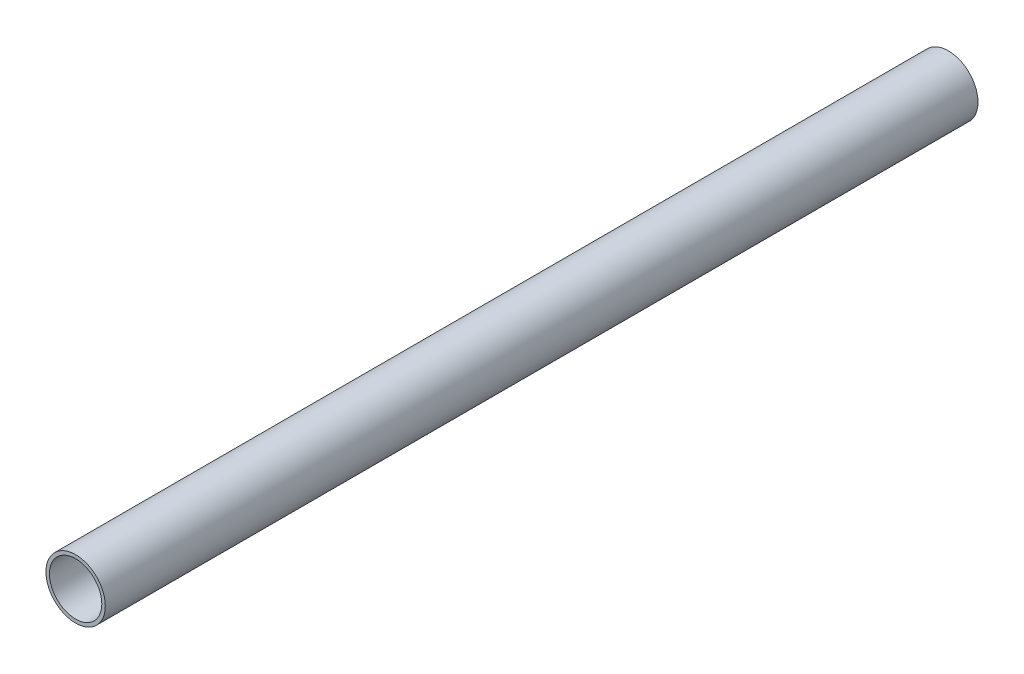
ISO-10303-21;
HEADER;
FILE_DESCRIPTION(('STEP AP214'),'2;1');
FILE_NAME('part.step','',(''),(''),'','','');
FILE_SCHEMA(('AUTOMOTIVE_DESIGN { 1 0 10303 214 1 1 1 1 }'));
ENDSEC;
DATA;
#1=APPLICATION_CONTEXT('core data for automotive mechanical design processes');
#2=APPLICATION_PROTOCOL_DEFINITION('international standard','automotive_design',2000,#1);
#3=PRODUCT_CONTEXT('',#1,'mechanical');
#4=PRODUCT('Part','Part','',(#3));
#5=PRODUCT_RELATED_PRODUCT_CATEGORY('part','',(#4));
#6=PRODUCT_DEFINITION_FORMATION('','',#4);
#7=PRODUCT_DEFINITION_CONTEXT('part definition',#1,'design');
#8=PRODUCT_DEFINITION('design','',#6,#7);
#9=PRODUCT_DEFINITION_SHAPE('','',#8);
#10=(LENGTH_UNIT() NAMED_UNIT(*) SI_UNIT(.MILLI.,.METRE.));
#11=(NAMED_UNIT(*) PLANE_ANGLE_UNIT() SI_UNIT($,.RADIAN.));
#12=(NAMED_UNIT(*) SI_UNIT($,.STERADIAN.) SOLID_ANGLE_UNIT());
#13=UNCERTAINTY_MEASURE_WITH_UNIT(LENGTH_MEASURE(1.E-05),#10,'distance_accuracy_value','');
#14=(GEOMETRIC_REPRESENTATION_CONTEXT(3) GLOBAL_UNCERTAINTY_ASSIGNED_CONTEXT((#13)) GLOBAL_UNIT_ASSIGNED_CONTEXT((#10,
#11,#12)) REPRESENTATION_CONTEXT('',''));
#15=CARTESIAN_POINT('',(0.,0.,0.));
#16=DIRECTION('',(0.,0.,1.));
#17=DIRECTION('',(1.,0.,0.));
#18=AXIS2_PLACEMENT_3D('',#15,#16,#17);
#19=CARTESIAN_POINT('',(0.,0.,250.));
#20=DIRECTION('',(0.,0.,-1.));
#21=DIRECTION('',(-1.,0.,0.));
#22=AXIS2_PLACEMENT_3D('',#19,#20,#21);
#23=CYLINDRICAL_SURFACE('',#22,15.);
#24=CARTESIAN_POINT('',(0.,0.,250.));
#25=DIRECTION('',(0.,0.,1.));
#26=DIRECTION('',(1.,0.,0.));
#27=AXIS2_PLACEMENT_3D('',#24,#25,#26);
#28=CIRCLE('',#27,15.);
#29=CARTESIAN_POINT('',(15.,0.,250.));
#30=VERTEX_POINT('',#29);
#31=EDGE_CURVE('E40',#30,#30,#28,.T.);
#32=ORIENTED_EDGE('',*,*,#31,.T.);
#33=EDGE_LOOP('',(#32));
#34=FACE_BOUND('',#33,.T.);
#35=CARTESIAN_POINT('',(0.,0.,-250.));
#36=DIRECTION('',(0.,0.,1.));
#37=DIRECTION('',(1.,0.,0.));
#38=AXIS2_PLACEMENT_3D('',#35,#36,#37);
#39=CIRCLE('',#38,15.);
#40=CARTESIAN_POINT('',(15.,0.,-250.));
#41=VERTEX_POINT('',#40);
#42=EDGE_CURVE('E46',#41,#41,#39,.T.);
#43=ORIENTED_EDGE('',*,*,#42,.F.);
#44=EDGE_LOOP('',(#43));
#45=FACE_BOUND('',#44,.T.);
#46=ADVANCED_FACE('F33',(#34,#45),#23,.F.);
#47=CARTESIAN_POINT('',(0.,0.,250.));
#48=DIRECTION('',(0.,0.,-1.));
#49=DIRECTION('',(-1.,0.,0.));
#50=AXIS2_PLACEMENT_3D('',#47,#48,#49);
#51=CYLINDRICAL_SURFACE('',#50,17.);
#52=CARTESIAN_POINT('',(0.,0.,250.));
#53=DIRECTION('',(0.,0.,1.));
#54=DIRECTION('',(1.,0.,0.));
#55=AXIS2_PLACEMENT_3D('',#52,#53,#54);
#56=CIRCLE('',#55,17.);
#57=CARTESIAN_POINT('',(17.,0.,250.));
#58=VERTEX_POINT('',#57);
#59=EDGE_CURVE('E10',#58,#58,#56,.T.);
#60=ORIENTED_EDGE('',*,*,#59,.F.);
#61=EDGE_LOOP('',(#60));
#62=FACE_BOUND('',#61,.T.);
#63=CARTESIAN_POINT('',(0.,0.,-250.));
#64=DIRECTION('',(0.,0.,1.));
#65=DIRECTION('',(1.,0.,0.));
#66=AXIS2_PLACEMENT_3D('',#63,#64,#65);
#67=CIRCLE('',#66,17.);
#68=CARTESIAN_POINT('',(17.,0.,-250.));
#69=VERTEX_POINT('',#68);
#70=EDGE_CURVE('E36',#69,#69,#67,.T.);
#71=ORIENTED_EDGE('',*,*,#70,.T.);
#72=EDGE_LOOP('',(#71));
#73=FACE_BOUND('',#72,.T.);
#74=ADVANCED_FACE('F53',(#62,#73),#51,.T.);
#75=CARTESIAN_POINT('',(0.,0.,250.));
#76=DIRECTION('',(0.,0.,1.));
#77=DIRECTION('',(1.,0.,0.));
#78=AXIS2_PLACEMENT_3D('',#75,#76,#77);
#79=PLANE('',#78);
#80=ORIENTED_EDGE('',*,*,#31,.F.);
#81=EDGE_LOOP('',(#80));
#82=FACE_BOUND('',#81,.T.);
#83=ORIENTED_EDGE('',*,*,#59,.T.);
#84=EDGE_LOOP('',(#83));
#85=FACE_BOUND('',#84,.T.);
#86=ADVANCED_FACE('F57',(#82,#85),#79,.T.);
#87=CARTESIAN_POINT('',(0.,0.,-250.));
#88=DIRECTION('',(0.,0.,1.));
#89=DIRECTION('',(1.,0.,0.));
#90=AXIS2_PLACEMENT_3D('',#87,#88,#89);
#91=PLANE('',#90);
#92=ORIENTED_EDGE('',*,*,#42,.T.);
#93=EDGE_LOOP('',(#92));
#94=FACE_BOUND('',#93,.T.);
#95=ORIENTED_EDGE('',*,*,#70,.F.);
#96=EDGE_LOOP('',(#95));
#97=FACE_BOUND('',#96,.T.);
#98=ADVANCED_FACE('F55',(#94,#97),#91,.F.);
#99=CLOSED_SHELL('',(#46,#74,#86,#98));
#100=MANIFOLD_SOLID_BREP('B2',#99);
#101=ADVANCED_BREP_SHAPE_REPRESENTATION('',(#18,#100),#14);
#102=SHAPE_DEFINITION_REPRESENTATION(#9,#101);
ENDSEC;
END-ISO-10303-21;
